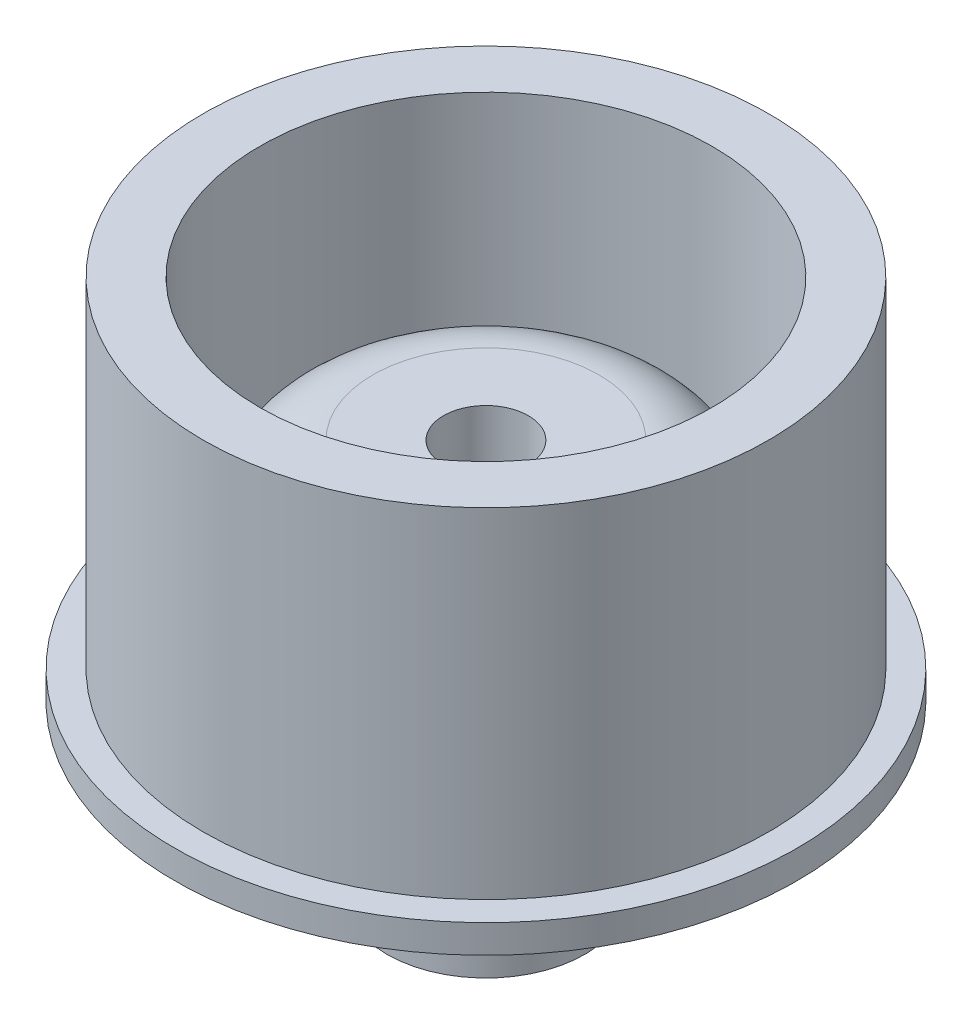
ISO-10303-21;
HEADER;
FILE_DESCRIPTION(('STEP AP214'),'2;1');
FILE_NAME('part.step','',(''),(''),'','','');
FILE_SCHEMA(('AUTOMOTIVE_DESIGN { 1 0 10303 214 1 1 1 1 }'));
ENDSEC;
DATA;
#1=APPLICATION_CONTEXT('core data for automotive mechanical design processes');
#2=APPLICATION_PROTOCOL_DEFINITION('international standard','automotive_design',2000,#1);
#3=PRODUCT_CONTEXT('',#1,'mechanical');
#4=PRODUCT('Part','Part','',(#3));
#5=PRODUCT_RELATED_PRODUCT_CATEGORY('part','',(#4));
#6=PRODUCT_DEFINITION_FORMATION('','',#4);
#7=PRODUCT_DEFINITION_CONTEXT('part definition',#1,'design');
#8=PRODUCT_DEFINITION('design','',#6,#7);
#9=PRODUCT_DEFINITION_SHAPE('','',#8);
#10=(LENGTH_UNIT() NAMED_UNIT(*) SI_UNIT(.MILLI.,.METRE.));
#11=(NAMED_UNIT(*) PLANE_ANGLE_UNIT() SI_UNIT($,.RADIAN.));
#12=(NAMED_UNIT(*) SI_UNIT($,.STERADIAN.) SOLID_ANGLE_UNIT());
#13=UNCERTAINTY_MEASURE_WITH_UNIT(LENGTH_MEASURE(1.E-05),#10,'distance_accuracy_value','');
#14=(GEOMETRIC_REPRESENTATION_CONTEXT(3) GLOBAL_UNCERTAINTY_ASSIGNED_CONTEXT((#13)) GLOBAL_UNIT_ASSIGNED_CONTEXT((#10,
#11,#12)) REPRESENTATION_CONTEXT('',''));
#15=CARTESIAN_POINT('',(0.,0.,0.));
#16=DIRECTION('',(0.,0.,1.));
#17=DIRECTION('',(1.,0.,0.));
#18=AXIS2_PLACEMENT_3D('',#15,#16,#17);
#19=CARTESIAN_POINT('',(0.,12.,0.));
#20=DIRECTION('',(0.,-1.,0.));
#21=DIRECTION('',(0.,0.,-1.));
#22=AXIS2_PLACEMENT_3D('',#19,#20,#21);
#23=CYLINDRICAL_SURFACE('',#22,10.);
#24=CARTESIAN_POINT('',(0.,12.,0.));
#25=DIRECTION('',(0.,1.,0.));
#26=DIRECTION('',(0.,0.,1.));
#27=AXIS2_PLACEMENT_3D('',#24,#25,#26);
#28=CIRCLE('',#27,10.);
#29=CARTESIAN_POINT('',(0.,12.,10.));
#30=VERTEX_POINT('',#29);
#31=EDGE_CURVE('E48',#30,#30,#28,.T.);
#32=ORIENTED_EDGE('',*,*,#31,.F.);
#33=EDGE_LOOP('',(#32));
#34=FACE_BOUND('',#33,.T.);
#35=CARTESIAN_POINT('',(0.,0.,0.));
#36=DIRECTION('',(0.,1.,0.));
#37=DIRECTION('',(0.,0.,1.));
#38=AXIS2_PLACEMENT_3D('',#35,#36,#37);
#39=CIRCLE('',#38,10.);
#40=CARTESIAN_POINT('',(0.,0.,10.));
#41=VERTEX_POINT('',#40);
#42=EDGE_CURVE('E52',#41,#41,#39,.T.);
#43=ORIENTED_EDGE('',*,*,#42,.T.);
#44=EDGE_LOOP('',(#43));
#45=FACE_BOUND('',#44,.T.);
#46=ADVANCED_FACE('F37',(#34,#45),#23,.T.);
#47=CARTESIAN_POINT('',(0.,12.,0.));
#48=DIRECTION('',(0.,1.,0.));
#49=DIRECTION('',(0.,0.,1.));
#50=AXIS2_PLACEMENT_3D('',#47,#48,#49);
#51=PLANE('',#50);
#52=CARTESIAN_POINT('',(0.,12.,0.));
#53=DIRECTION('',(0.,1.,0.));
#54=DIRECTION('',(0.,0.,1.));
#55=AXIS2_PLACEMENT_3D('',#52,#53,#54);
#56=CIRCLE('',#55,8.);
#57=CARTESIAN_POINT('',(0.,12.,8.));
#58=VERTEX_POINT('',#57);
#59=EDGE_CURVE('E78',#58,#58,#56,.T.);
#60=ORIENTED_EDGE('',*,*,#59,.F.);
#61=EDGE_LOOP('',(#60));
#62=FACE_BOUND('',#61,.T.);
#63=ORIENTED_EDGE('',*,*,#31,.T.);
#64=EDGE_LOOP('',(#63));
#65=FACE_BOUND('',#64,.T.);
#66=ADVANCED_FACE('F109',(#62,#65),#51,.T.);
#67=CARTESIAN_POINT('',(0.,-1.,0.));
#68=DIRECTION('',(0.,1.,0.));
#69=DIRECTION('',(0.,0.,1.));
#70=AXIS2_PLACEMENT_3D('',#67,#68,#69);
#71=CYLINDRICAL_SURFACE('',#70,11.);
#72=CARTESIAN_POINT('',(0.,-1.,0.));
#73=DIRECTION('',(0.,-1.,0.));
#74=DIRECTION('',(0.,0.,-1.));
#75=AXIS2_PLACEMENT_3D('',#72,#73,#74);
#76=CIRCLE('',#75,11.);
#77=CARTESIAN_POINT('',(0.,-1.,-11.));
#78=VERTEX_POINT('',#77);
#79=EDGE_CURVE('E61',#78,#78,#76,.T.);
#80=ORIENTED_EDGE('',*,*,#79,.F.);
#81=EDGE_LOOP('',(#80));
#82=FACE_BOUND('',#81,.T.);
#83=CARTESIAN_POINT('',(0.,0.,0.));
#84=DIRECTION('',(0.,-1.,0.));
#85=DIRECTION('',(0.,0.,-1.));
#86=AXIS2_PLACEMENT_3D('',#83,#84,#85);
#87=CIRCLE('',#86,11.);
#88=CARTESIAN_POINT('',(0.,0.,-11.));
#89=VERTEX_POINT('',#88);
#90=EDGE_CURVE('E58',#89,#89,#87,.T.);
#91=ORIENTED_EDGE('',*,*,#90,.T.);
#92=EDGE_LOOP('',(#91));
#93=FACE_BOUND('',#92,.T.);
#94=ADVANCED_FACE('F115',(#82,#93),#71,.T.);
#95=CARTESIAN_POINT('',(0.,-1.,0.));
#96=DIRECTION('',(0.,-1.,0.));
#97=DIRECTION('',(0.,0.,-1.));
#98=AXIS2_PLACEMENT_3D('',#95,#96,#97);
#99=PLANE('',#98);
#100=CARTESIAN_POINT('',(0.,-1.,0.));
#101=DIRECTION('',(0.,-1.,0.));
#102=DIRECTION('',(0.,0.,-1.));
#103=AXIS2_PLACEMENT_3D('',#100,#101,#102);
#104=CIRCLE('',#103,5.);
#105=CARTESIAN_POINT('',(0.,-1.,5.));
#106=VERTEX_POINT('',#105);
#107=EDGE_CURVE('E55',#106,#106,#104,.F.);
#108=ORIENTED_EDGE('',*,*,#107,.T.);
#109=EDGE_LOOP('',(#108));
#110=FACE_BOUND('',#109,.T.);
#111=ORIENTED_EDGE('',*,*,#79,.T.);
#112=EDGE_LOOP('',(#111));
#113=FACE_BOUND('',#112,.T.);
#114=ADVANCED_FACE('F122',(#110,#113),#99,.T.);
#115=CARTESIAN_POINT('',(0.,0.,0.));
#116=DIRECTION('',(0.,-1.,0.));
#117=DIRECTION('',(0.,0.,-1.));
#118=AXIS2_PLACEMENT_3D('',#115,#116,#117);
#119=PLANE('',#118);
#120=ORIENTED_EDGE('',*,*,#42,.F.);
#121=EDGE_LOOP('',(#120));
#122=FACE_BOUND('',#121,.T.);
#123=ORIENTED_EDGE('',*,*,#90,.F.);
#124=EDGE_LOOP('',(#123));
#125=FACE_BOUND('',#124,.T.);
#126=ADVANCED_FACE('F124',(#122,#125),#119,.F.);
#127=CARTESIAN_POINT('',(0.,-1.000012,0.));
#128=DIRECTION('',(0.,1.,0.));
#129=DIRECTION('',(0.,0.,1.));
#130=AXIS2_PLACEMENT_3D('',#127,#128,#129);
#131=CYLINDRICAL_SURFACE('',#130,5.);
#132=CARTESIAN_POINT('',(0.,5.,0.));
#133=DIRECTION('',(0.,-1.,0.));
#134=DIRECTION('',(0.,0.,-1.));
#135=AXIS2_PLACEMENT_3D('',#132,#133,#134);
#136=CIRCLE('',#135,5.);
#137=CARTESIAN_POINT('',(0.,5.,5.));
#138=VERTEX_POINT('',#137);
#139=EDGE_CURVE('E59',#138,#138,#136,.T.);
#140=CARTESIAN_POINT('',(0.,-1.,5.));
#141=CARTESIAN_POINT('',(0.,-0.9375,5.));
#142=CARTESIAN_POINT('',(0.,-0.875,5.));
#143=CARTESIAN_POINT('',(0.,-0.75,5.));
#144=CARTESIAN_POINT('',(0.,-0.6875,5.));
#145=CARTESIAN_POINT('',(0.,-0.5625,5.));
#146=CARTESIAN_POINT('',(0.,-0.5,5.));
#147=CARTESIAN_POINT('',(0.,-0.375,5.));
#148=CARTESIAN_POINT('',(0.,-0.3125,5.));
#149=CARTESIAN_POINT('',(0.,-0.1875,5.));
#150=CARTESIAN_POINT('',(0.,-0.125,5.));
#151=CARTESIAN_POINT('',(0.,0.,5.));
#152=CARTESIAN_POINT('',(0.,0.0625000000000001,5.));
#153=CARTESIAN_POINT('',(0.,0.1875,5.));
#154=CARTESIAN_POINT('',(0.,0.25,5.));
#155=CARTESIAN_POINT('',(0.,0.375,5.));
#156=CARTESIAN_POINT('',(0.,0.4375,5.));
#157=CARTESIAN_POINT('',(0.,0.5625,5.));
#158=CARTESIAN_POINT('',(0.,0.625,5.));
#159=CARTESIAN_POINT('',(0.,0.75,5.));
#160=CARTESIAN_POINT('',(0.,0.8125,5.));
#161=CARTESIAN_POINT('',(0.,0.9375,5.));
#162=CARTESIAN_POINT('',(0.,1.,5.));
#163=CARTESIAN_POINT('',(0.,1.125,5.));
#164=CARTESIAN_POINT('',(0.,1.1875,5.));
#165=CARTESIAN_POINT('',(0.,1.3125,5.));
#166=CARTESIAN_POINT('',(0.,1.375,5.));
#167=CARTESIAN_POINT('',(0.,1.5,5.));
#168=CARTESIAN_POINT('',(0.,1.5625,5.));
#169=CARTESIAN_POINT('',(0.,1.6875,5.));
#170=CARTESIAN_POINT('',(0.,1.75,5.));
#171=CARTESIAN_POINT('',(0.,1.875,5.));
#172=CARTESIAN_POINT('',(0.,1.9375,5.));
#173=CARTESIAN_POINT('',(0.,2.0625,5.));
#174=CARTESIAN_POINT('',(0.,2.125,5.));
#175=CARTESIAN_POINT('',(0.,2.25,5.));
#176=CARTESIAN_POINT('',(0.,2.3125,5.));
#177=CARTESIAN_POINT('',(0.,2.4375,5.));
#178=CARTESIAN_POINT('',(0.,2.5,5.));
#179=CARTESIAN_POINT('',(0.,2.625,5.));
#180=CARTESIAN_POINT('',(0.,2.6875,5.));
#181=CARTESIAN_POINT('',(0.,2.8125,5.));
#182=CARTESIAN_POINT('',(0.,2.875,5.));
#183=CARTESIAN_POINT('',(0.,3.,5.));
#184=CARTESIAN_POINT('',(0.,3.0625,5.));
#185=CARTESIAN_POINT('',(0.,3.1875,5.));
#186=CARTESIAN_POINT('',(0.,3.25,5.));
#187=CARTESIAN_POINT('',(0.,3.375,5.));
#188=CARTESIAN_POINT('',(0.,3.4375,5.));
#189=CARTESIAN_POINT('',(0.,3.5625,5.));
#190=CARTESIAN_POINT('',(0.,3.625,5.));
#191=CARTESIAN_POINT('',(0.,3.75,5.));
#192=CARTESIAN_POINT('',(0.,3.8125,5.));
#193=CARTESIAN_POINT('',(0.,3.9375,5.));
#194=CARTESIAN_POINT('',(0.,4.,5.));
#195=CARTESIAN_POINT('',(0.,4.125,5.));
#196=CARTESIAN_POINT('',(0.,4.1875,5.));
#197=CARTESIAN_POINT('',(0.,4.3125,5.));
#198=CARTESIAN_POINT('',(0.,4.375,5.));
#199=CARTESIAN_POINT('',(0.,4.5,5.));
#200=CARTESIAN_POINT('',(0.,4.5625,5.));
#201=CARTESIAN_POINT('',(0.,4.6875,5.));
#202=CARTESIAN_POINT('',(0.,4.75,5.));
#203=CARTESIAN_POINT('',(0.,4.875,5.));
#204=CARTESIAN_POINT('',(0.,4.9375,5.));
#205=CARTESIAN_POINT('',(0.,5.,5.));
#206=B_SPLINE_CURVE_WITH_KNOTS('',3,(#140,#141,#142,#143,#144,#145,#146,#147,#148,#149,#150,
#151,#152,#153,#154,#155,#156,#157,#158,#159,#160,#161,#162,#163,#164,#165,#166,#167,#168,#169,
#170,#171,#172,#173,#174,#175,#176,#177,#178,#179,#180,#181,#182,#183,#184,#185,#186,#187,#188,
#189,#190,#191,#192,#193,#194,#195,#196,#197,#198,#199,#200,#201,#202,#203,#204,#205),
.UNSPECIFIED.,.F.,.F.,(4,2,2,2,2,2,2,2,2,2,2,2,2,2,2,2,2,2,2,2,2,2,2,2,2,2,2,2,2,2,2,2,4),(0.,
0.1875,0.375,0.5625,0.75,0.9375,1.125,1.3125,1.5,1.6875,1.875,2.0625,2.25,2.4375,2.625,2.8125,
3.,3.1875,3.375,3.5625,3.75,3.9375,4.125,4.3125,4.5,4.6875,4.875,5.0625,5.25,5.4375,5.625,
5.8125,6.),.UNSPECIFIED.);
#207=EDGE_CURVE('BSEAM127',#106,#138,#206,.T.);
#208=ORIENTED_EDGE('',*,*,#107,.F.);
#209=ORIENTED_EDGE('',*,*,#139,.F.);
#210=ORIENTED_EDGE('',*,*,#207,.T.);
#211=ORIENTED_EDGE('',*,*,#207,.F.);
#212=EDGE_LOOP('',(#208,#210,#209,#211));
#213=FACE_BOUND('',#212,.T.);
#214=ADVANCED_FACE('F127',(#213),#131,.F.);
#215=CARTESIAN_POINT('',(0.,-1.000012,0.));
#216=DIRECTION('',(0.,1.,0.));
#217=DIRECTION('',(0.,0.,1.));
#218=AXIS2_PLACEMENT_3D('',#215,#216,#217);
#219=CYLINDRICAL_SURFACE('',#218,3.5);
#220=CARTESIAN_POINT('',(0.,5.,0.));
#221=DIRECTION('',(0.,-1.,0.));
#222=DIRECTION('',(0.,0.,-1.));
#223=AXIS2_PLACEMENT_3D('',#220,#221,#222);
#224=CIRCLE('',#223,3.5);
#225=CARTESIAN_POINT('',(0.,5.,3.5));
#226=VERTEX_POINT('',#225);
#227=EDGE_CURVE('E69',#226,#226,#224,.T.);
#228=CARTESIAN_POINT('',(0.,-7.,0.));
#229=DIRECTION('',(0.,-1.,0.));
#230=DIRECTION('',(0.,0.,-1.));
#231=AXIS2_PLACEMENT_3D('',#228,#229,#230);
#232=CIRCLE('',#231,3.5);
#233=CARTESIAN_POINT('',(0.,-7.,3.5));
#234=VERTEX_POINT('',#233);
#235=EDGE_CURVE('E72',#234,#234,#232,.T.);
#236=CARTESIAN_POINT('',(0.,5.,3.5));
#237=CARTESIAN_POINT('',(0.,4.875,3.5));
#238=CARTESIAN_POINT('',(0.,4.75,3.5));
#239=CARTESIAN_POINT('',(0.,4.5,3.5));
#240=CARTESIAN_POINT('',(0.,4.375,3.5));
#241=CARTESIAN_POINT('',(0.,4.125,3.5));
#242=CARTESIAN_POINT('',(0.,4.,3.5));
#243=CARTESIAN_POINT('',(0.,3.75,3.5));
#244=CARTESIAN_POINT('',(0.,3.625,3.5));
#245=CARTESIAN_POINT('',(0.,3.375,3.5));
#246=CARTESIAN_POINT('',(0.,3.25,3.5));
#247=CARTESIAN_POINT('',(0.,3.,3.5));
#248=CARTESIAN_POINT('',(0.,2.875,3.5));
#249=CARTESIAN_POINT('',(0.,2.625,3.5));
#250=CARTESIAN_POINT('',(0.,2.5,3.5));
#251=CARTESIAN_POINT('',(0.,2.25,3.5));
#252=CARTESIAN_POINT('',(0.,2.125,3.5));
#253=CARTESIAN_POINT('',(0.,1.875,3.5));
#254=CARTESIAN_POINT('',(0.,1.75,3.5));
#255=CARTESIAN_POINT('',(0.,1.5,3.5));
#256=CARTESIAN_POINT('',(0.,1.375,3.5));
#257=CARTESIAN_POINT('',(0.,1.125,3.5));
#258=CARTESIAN_POINT('',(0.,1.,3.5));
#259=CARTESIAN_POINT('',(0.,0.75,3.5));
#260=CARTESIAN_POINT('',(0.,0.625,3.5));
#261=CARTESIAN_POINT('',(0.,0.375,3.5));
#262=CARTESIAN_POINT('',(0.,0.25,3.5));
#263=CARTESIAN_POINT('',(0.,0.,3.5));
#264=CARTESIAN_POINT('',(0.,-0.125,3.5));
#265=CARTESIAN_POINT('',(0.,-0.375,3.5));
#266=CARTESIAN_POINT('',(0.,-0.5,3.5));
#267=CARTESIAN_POINT('',(0.,-0.75,3.5));
#268=CARTESIAN_POINT('',(0.,-0.875,3.5));
#269=CARTESIAN_POINT('',(0.,-1.125,3.5));
#270=CARTESIAN_POINT('',(0.,-1.25,3.5));
#271=CARTESIAN_POINT('',(0.,-1.5,3.5));
#272=CARTESIAN_POINT('',(0.,-1.625,3.5));
#273=CARTESIAN_POINT('',(0.,-1.875,3.5));
#274=CARTESIAN_POINT('',(0.,-2.,3.5));
#275=CARTESIAN_POINT('',(0.,-2.25,3.5));
#276=CARTESIAN_POINT('',(0.,-2.375,3.5));
#277=CARTESIAN_POINT('',(0.,-2.625,3.5));
#278=CARTESIAN_POINT('',(0.,-2.75,3.5));
#279=CARTESIAN_POINT('',(0.,-3.,3.5));
#280=CARTESIAN_POINT('',(0.,-3.125,3.5));
#281=CARTESIAN_POINT('',(0.,-3.375,3.5));
#282=CARTESIAN_POINT('',(0.,-3.5,3.5));
#283=CARTESIAN_POINT('',(0.,-3.75,3.5));
#284=CARTESIAN_POINT('',(0.,-3.875,3.5));
#285=CARTESIAN_POINT('',(0.,-4.125,3.5));
#286=CARTESIAN_POINT('',(0.,-4.25,3.5));
#287=CARTESIAN_POINT('',(0.,-4.5,3.5));
#288=CARTESIAN_POINT('',(0.,-4.625,3.5));
#289=CARTESIAN_POINT('',(0.,-4.875,3.5));
#290=CARTESIAN_POINT('',(0.,-5.,3.5));
#291=CARTESIAN_POINT('',(0.,-5.25,3.5));
#292=CARTESIAN_POINT('',(0.,-5.375,3.5));
#293=CARTESIAN_POINT('',(0.,-5.625,3.5));
#294=CARTESIAN_POINT('',(0.,-5.75,3.5));
#295=CARTESIAN_POINT('',(0.,-6.,3.5));
#296=CARTESIAN_POINT('',(0.,-6.125,3.5));
#297=CARTESIAN_POINT('',(0.,-6.375,3.5));
#298=CARTESIAN_POINT('',(0.,-6.5,3.5));
#299=CARTESIAN_POINT('',(0.,-6.75,3.5));
#300=CARTESIAN_POINT('',(0.,-6.875,3.5));
#301=CARTESIAN_POINT('',(0.,-7.,3.5));
#302=B_SPLINE_CURVE_WITH_KNOTS('',3,(#236,#237,#238,#239,#240,#241,#242,#243,#244,#245,#246,
#247,#248,#249,#250,#251,#252,#253,#254,#255,#256,#257,#258,#259,#260,#261,#262,#263,#264,#265,
#266,#267,#268,#269,#270,#271,#272,#273,#274,#275,#276,#277,#278,#279,#280,#281,#282,#283,#284,
#285,#286,#287,#288,#289,#290,#291,#292,#293,#294,#295,#296,#297,#298,#299,#300,#301),
.UNSPECIFIED.,.F.,.F.,(4,2,2,2,2,2,2,2,2,2,2,2,2,2,2,2,2,2,2,2,2,2,2,2,2,2,2,2,2,2,2,2,4),(0.,
0.375,0.75,1.125,1.5,1.875,2.25,2.625,3.,3.375,3.75,4.125,4.5,4.875,5.25,5.625,6.,6.375,6.75,
7.125,7.5,7.875,8.25,8.625,9.,9.375,9.75,10.125,10.5,10.875,11.25,11.625,12.),.UNSPECIFIED.);
#303=EDGE_CURVE('BSEAM134',#226,#234,#302,.T.);
#304=ORIENTED_EDGE('',*,*,#227,.T.);
#305=ORIENTED_EDGE('',*,*,#235,.F.);
#306=ORIENTED_EDGE('',*,*,#303,.T.);
#307=ORIENTED_EDGE('',*,*,#303,.F.);
#308=EDGE_LOOP('',(#304,#306,#305,#307));
#309=FACE_BOUND('',#308,.T.);
#310=ADVANCED_FACE('F134',(#309),#219,.T.);
#311=CARTESIAN_POINT('',(0.,5.,0.));
#312=DIRECTION('',(0.,-1.,0.));
#313=DIRECTION('',(0.,0.,-1.));
#314=AXIS2_PLACEMENT_3D('',#311,#312,#313);
#315=PLANE('',#314);
#316=ORIENTED_EDGE('',*,*,#227,.F.);
#317=EDGE_LOOP('',(#316));
#318=FACE_BOUND('',#317,.T.);
#319=ORIENTED_EDGE('',*,*,#139,.T.);
#320=EDGE_LOOP('',(#319));
#321=FACE_BOUND('',#320,.T.);
#322=ADVANCED_FACE('F138',(#318,#321),#315,.T.);
#323=CARTESIAN_POINT('',(0.,-7.,0.));
#324=DIRECTION('',(0.,-1.,0.));
#325=DIRECTION('',(0.,0.,-1.));
#326=AXIS2_PLACEMENT_3D('',#323,#324,#325);
#327=PLANE('',#326);
#328=ORIENTED_EDGE('',*,*,#235,.T.);
#329=EDGE_LOOP('',(#328));
#330=FACE_BOUND('',#329,.T.);
#331=ADVANCED_FACE('F105',(#330),#327,.T.);
#332=CARTESIAN_POINT('',(0.,12.,0.));
#333=DIRECTION('',(0.,-1.,0.));
#334=DIRECTION('',(0.,0.,-1.));
#335=AXIS2_PLACEMENT_3D('',#332,#333,#334);
#336=CYLINDRICAL_SURFACE('',#335,8.);
#337=ORIENTED_EDGE('',*,*,#59,.T.);
#338=EDGE_LOOP('',(#337));
#339=FACE_BOUND('',#338,.T.);
#340=CARTESIAN_POINT('',(0.,1.,0.));
#341=DIRECTION('',(0.,-1.,0.));
#342=DIRECTION('',(0.,0.,-1.));
#343=AXIS2_PLACEMENT_3D('',#340,#341,#342);
#344=CIRCLE('',#343,8.);
#345=CARTESIAN_POINT('',(0.,1.,-8.));
#346=VERTEX_POINT('',#345);
#347=EDGE_CURVE('E75',#346,#346,#344,.F.);
#348=ORIENTED_EDGE('',*,*,#347,.F.);
#349=EDGE_LOOP('',(#348));
#350=FACE_BOUND('',#349,.T.);
#351=ADVANCED_FACE('F95',(#339,#350),#336,.F.);
#352=CARTESIAN_POINT('',(0.,1.,0.));
#353=DIRECTION('',(0.,-1.,0.));
#354=DIRECTION('',(0.,0.,-1.));
#355=AXIS2_PLACEMENT_3D('',#352,#353,#354);
#356=PLANE('',#355);
#357=ORIENTED_EDGE('',*,*,#347,.T.);
#358=EDGE_LOOP('',(#357));
#359=FACE_BOUND('',#358,.T.);
#360=CARTESIAN_POINT('',(0.,1.,0.));
#361=DIRECTION('',(0.,-1.,0.));
#362=DIRECTION('',(0.,0.,-1.));
#363=AXIS2_PLACEMENT_3D('',#360,#361,#362);
#364=CIRCLE('',#363,7.);
#365=CARTESIAN_POINT('',(0.,1.,7.));
#366=VERTEX_POINT('',#365);
#367=EDGE_CURVE('E81',#366,#366,#364,.F.);
#368=ORIENTED_EDGE('',*,*,#367,.F.);
#369=EDGE_LOOP('',(#368));
#370=FACE_BOUND('',#369,.T.);
#371=ADVANCED_FACE('F93',(#359,#370),#356,.F.);
#372=CARTESIAN_POINT('',(0.,-1.000012,0.));
#373=DIRECTION('',(0.,1.,0.));
#374=DIRECTION('',(0.,0.,1.));
#375=AXIS2_PLACEMENT_3D('',#372,#373,#374);
#376=CYLINDRICAL_SURFACE('',#375,7.);
#377=CARTESIAN_POINT('',(0.,4.,0.));
#378=DIRECTION('',(0.,-1.,0.));
#379=DIRECTION('',(0.,0.,-1.));
#380=AXIS2_PLACEMENT_3D('',#377,#378,#379);
#381=CIRCLE('',#380,7.);
#382=CARTESIAN_POINT('',(0.,4.,7.));
#383=VERTEX_POINT('',#382);
#384=EDGE_CURVE('E44',#383,#383,#381,.T.);
#385=CARTESIAN_POINT('',(0.,4.,7.));
#386=CARTESIAN_POINT('',(0.,3.96875,7.));
#387=CARTESIAN_POINT('',(0.,3.9375,7.));
#388=CARTESIAN_POINT('',(0.,3.875,7.));
#389=CARTESIAN_POINT('',(0.,3.84375,7.));
#390=CARTESIAN_POINT('',(0.,3.78125,7.));
#391=CARTESIAN_POINT('',(0.,3.75,7.));
#392=CARTESIAN_POINT('',(0.,3.6875,7.));
#393=CARTESIAN_POINT('',(0.,3.65625,7.));
#394=CARTESIAN_POINT('',(0.,3.59375,7.));
#395=CARTESIAN_POINT('',(0.,3.5625,7.));
#396=CARTESIAN_POINT('',(0.,3.5,7.));
#397=CARTESIAN_POINT('',(0.,3.46875,7.));
#398=CARTESIAN_POINT('',(0.,3.40625,7.));
#399=CARTESIAN_POINT('',(0.,3.375,7.));
#400=CARTESIAN_POINT('',(0.,3.3125,7.));
#401=CARTESIAN_POINT('',(0.,3.28125,7.));
#402=CARTESIAN_POINT('',(0.,3.21875,7.));
#403=CARTESIAN_POINT('',(0.,3.1875,7.));
#404=CARTESIAN_POINT('',(0.,3.125,7.));
#405=CARTESIAN_POINT('',(0.,3.09375,7.));
#406=CARTESIAN_POINT('',(0.,3.03125,7.));
#407=CARTESIAN_POINT('',(0.,3.,7.));
#408=CARTESIAN_POINT('',(0.,2.9375,7.));
#409=CARTESIAN_POINT('',(0.,2.90625,7.));
#410=CARTESIAN_POINT('',(0.,2.84375,7.));
#411=CARTESIAN_POINT('',(0.,2.8125,7.));
#412=CARTESIAN_POINT('',(0.,2.75,7.));
#413=CARTESIAN_POINT('',(0.,2.71875,7.));
#414=CARTESIAN_POINT('',(0.,2.65625,7.));
#415=CARTESIAN_POINT('',(0.,2.625,7.));
#416=CARTESIAN_POINT('',(0.,2.5625,7.));
#417=CARTESIAN_POINT('',(0.,2.53125,7.));
#418=CARTESIAN_POINT('',(0.,2.46875,7.));
#419=CARTESIAN_POINT('',(0.,2.4375,7.));
#420=CARTESIAN_POINT('',(0.,2.375,7.));
#421=CARTESIAN_POINT('',(0.,2.34375,7.));
#422=CARTESIAN_POINT('',(0.,2.28125,7.));
#423=CARTESIAN_POINT('',(0.,2.25,7.));
#424=CARTESIAN_POINT('',(0.,2.1875,7.));
#425=CARTESIAN_POINT('',(0.,2.15625,7.));
#426=CARTESIAN_POINT('',(0.,2.09375,7.));
#427=CARTESIAN_POINT('',(0.,2.0625,7.));
#428=CARTESIAN_POINT('',(0.,2.,7.));
#429=CARTESIAN_POINT('',(0.,1.96875,7.));
#430=CARTESIAN_POINT('',(0.,1.90625,7.));
#431=CARTESIAN_POINT('',(0.,1.875,7.));
#432=CARTESIAN_POINT('',(0.,1.8125,7.));
#433=CARTESIAN_POINT('',(0.,1.78125,7.));
#434=CARTESIAN_POINT('',(0.,1.71875,7.));
#435=CARTESIAN_POINT('',(0.,1.6875,7.));
#436=CARTESIAN_POINT('',(0.,1.625,7.));
#437=CARTESIAN_POINT('',(0.,1.59375,7.));
#438=CARTESIAN_POINT('',(0.,1.53125,7.));
#439=CARTESIAN_POINT('',(0.,1.5,7.));
#440=CARTESIAN_POINT('',(0.,1.4375,7.));
#441=CARTESIAN_POINT('',(0.,1.40625,7.));
#442=CARTESIAN_POINT('',(0.,1.34375,7.));
#443=CARTESIAN_POINT('',(0.,1.3125,7.));
#444=CARTESIAN_POINT('',(0.,1.25,7.));
#445=CARTESIAN_POINT('',(0.,1.21875,7.));
#446=CARTESIAN_POINT('',(0.,1.15625,7.));
#447=CARTESIAN_POINT('',(0.,1.125,7.));
#448=CARTESIAN_POINT('',(0.,1.0625,7.));
#449=CARTESIAN_POINT('',(0.,1.03125,7.));
#450=CARTESIAN_POINT('',(0.,1.,7.));
#451=B_SPLINE_CURVE_WITH_KNOTS('',3,(#385,#386,#387,#388,#389,#390,#391,#392,#393,#394,#395,
#396,#397,#398,#399,#400,#401,#402,#403,#404,#405,#406,#407,#408,#409,#410,#411,#412,#413,#414,
#415,#416,#417,#418,#419,#420,#421,#422,#423,#424,#425,#426,#427,#428,#429,#430,#431,#432,#433,
#434,#435,#436,#437,#438,#439,#440,#441,#442,#443,#444,#445,#446,#447,#448,#449,#450),
.UNSPECIFIED.,.F.,.F.,(4,2,2,2,2,2,2,2,2,2,2,2,2,2,2,2,2,2,2,2,2,2,2,2,2,2,2,2,2,2,2,2,4),(0.,
0.0937500000000001,0.1875,0.28125,0.375,0.46875,0.5625,0.656250000000001,0.750000000000001,
0.843750000000001,0.937500000000001,1.03125,1.125,1.21875,1.3125,1.40625,1.5,1.59375,1.6875,
1.78125,1.875,1.96875,2.0625,2.15625,2.25,2.34375,2.4375,2.53125,2.625,2.71875,2.8125,2.90625,
3.),.UNSPECIFIED.);
#452=EDGE_CURVE('BSEAM91',#383,#366,#451,.T.);
#453=ORIENTED_EDGE('',*,*,#384,.T.);
#454=ORIENTED_EDGE('',*,*,#367,.T.);
#455=ORIENTED_EDGE('',*,*,#452,.T.);
#456=ORIENTED_EDGE('',*,*,#452,.F.);
#457=EDGE_LOOP('',(#453,#455,#454,#456));
#458=FACE_BOUND('',#457,.T.);
#459=ADVANCED_FACE('F91',(#458),#376,.T.);
#460=CARTESIAN_POINT('',(0.,-1.000012,0.));
#461=DIRECTION('',(0.,1.,0.));
#462=DIRECTION('',(0.,0.,1.));
#463=AXIS2_PLACEMENT_3D('',#460,#461,#462);
#464=CYLINDRICAL_SURFACE('',#463,1.5);
#465=CARTESIAN_POINT('',(0.,7.,0.));
#466=DIRECTION('',(0.,-1.,0.));
#467=DIRECTION('',(0.,0.,-1.));
#468=AXIS2_PLACEMENT_3D('',#465,#466,#467);
#469=CIRCLE('',#468,1.5);
#470=CARTESIAN_POINT('',(0.,7.,1.5));
#471=VERTEX_POINT('',#470);
#472=EDGE_CURVE('E85',#471,#471,#469,.T.);
#473=CARTESIAN_POINT('',(0.,-5.,0.));
#474=DIRECTION('',(0.,-1.,0.));
#475=DIRECTION('',(0.,0.,-1.));
#476=AXIS2_PLACEMENT_3D('',#473,#474,#475);
#477=CIRCLE('',#476,1.5);
#478=CARTESIAN_POINT('',(0.,-5.,1.5));
#479=VERTEX_POINT('',#478);
#480=EDGE_CURVE('E82',#479,#479,#477,.T.);
#481=CARTESIAN_POINT('',(0.,7.,1.5));
#482=CARTESIAN_POINT('',(0.,6.875,1.5));
#483=CARTESIAN_POINT('',(0.,6.75,1.5));
#484=CARTESIAN_POINT('',(0.,6.5,1.5));
#485=CARTESIAN_POINT('',(0.,6.375,1.5));
#486=CARTESIAN_POINT('',(0.,6.125,1.5));
#487=CARTESIAN_POINT('',(0.,6.,1.5));
#488=CARTESIAN_POINT('',(0.,5.75,1.5));
#489=CARTESIAN_POINT('',(0.,5.625,1.5));
#490=CARTESIAN_POINT('',(0.,5.375,1.5));
#491=CARTESIAN_POINT('',(0.,5.25,1.5));
#492=CARTESIAN_POINT('',(0.,5.,1.5));
#493=CARTESIAN_POINT('',(0.,4.875,1.5));
#494=CARTESIAN_POINT('',(0.,4.625,1.5));
#495=CARTESIAN_POINT('',(0.,4.5,1.5));
#496=CARTESIAN_POINT('',(0.,4.25,1.5));
#497=CARTESIAN_POINT('',(0.,4.125,1.5));
#498=CARTESIAN_POINT('',(0.,3.875,1.5));
#499=CARTESIAN_POINT('',(0.,3.75,1.5));
#500=CARTESIAN_POINT('',(0.,3.5,1.5));
#501=CARTESIAN_POINT('',(0.,3.375,1.5));
#502=CARTESIAN_POINT('',(0.,3.125,1.5));
#503=CARTESIAN_POINT('',(0.,3.,1.5));
#504=CARTESIAN_POINT('',(0.,2.75,1.5));
#505=CARTESIAN_POINT('',(0.,2.625,1.5));
#506=CARTESIAN_POINT('',(0.,2.375,1.5));
#507=CARTESIAN_POINT('',(0.,2.25,1.5));
#508=CARTESIAN_POINT('',(0.,2.,1.5));
#509=CARTESIAN_POINT('',(0.,1.875,1.5));
#510=CARTESIAN_POINT('',(0.,1.625,1.5));
#511=CARTESIAN_POINT('',(0.,1.5,1.5));
#512=CARTESIAN_POINT('',(0.,1.25,1.5));
#513=CARTESIAN_POINT('',(0.,1.125,1.5));
#514=CARTESIAN_POINT('',(0.,0.875000000000001,1.5));
#515=CARTESIAN_POINT('',(0.,0.750000000000001,1.5));
#516=CARTESIAN_POINT('',(0.,0.500000000000001,1.5));
#517=CARTESIAN_POINT('',(0.,0.375000000000001,1.5));
#518=CARTESIAN_POINT('',(0.,0.125000000000001,1.5));
#519=CARTESIAN_POINT('',(0.,0.,1.5));
#520=CARTESIAN_POINT('',(0.,-0.249999999999999,1.5));
#521=CARTESIAN_POINT('',(0.,-0.374999999999999,1.5));
#522=CARTESIAN_POINT('',(0.,-0.624999999999999,1.5));
#523=CARTESIAN_POINT('',(0.,-0.749999999999999,1.5));
#524=CARTESIAN_POINT('',(0.,-0.999999999999999,1.5));
#525=CARTESIAN_POINT('',(0.,-1.125,1.5));
#526=CARTESIAN_POINT('',(0.,-1.375,1.5));
#527=CARTESIAN_POINT('',(0.,-1.5,1.5));
#528=CARTESIAN_POINT('',(0.,-1.75,1.5));
#529=CARTESIAN_POINT('',(0.,-1.875,1.5));
#530=CARTESIAN_POINT('',(0.,-2.125,1.5));
#531=CARTESIAN_POINT('',(0.,-2.25,1.5));
#532=CARTESIAN_POINT('',(0.,-2.5,1.5));
#533=CARTESIAN_POINT('',(0.,-2.625,1.5));
#534=CARTESIAN_POINT('',(0.,-2.875,1.5));
#535=CARTESIAN_POINT('',(0.,-3.,1.5));
#536=CARTESIAN_POINT('',(0.,-3.25,1.5));
#537=CARTESIAN_POINT('',(0.,-3.375,1.5));
#538=CARTESIAN_POINT('',(0.,-3.625,1.5));
#539=CARTESIAN_POINT('',(0.,-3.75,1.5));
#540=CARTESIAN_POINT('',(0.,-4.,1.5));
#541=CARTESIAN_POINT('',(0.,-4.125,1.5));
#542=CARTESIAN_POINT('',(0.,-4.375,1.5));
#543=CARTESIAN_POINT('',(0.,-4.5,1.5));
#544=CARTESIAN_POINT('',(0.,-4.75,1.5));
#545=CARTESIAN_POINT('',(0.,-4.875,1.5));
#546=CARTESIAN_POINT('',(0.,-5.,1.5));
#547=B_SPLINE_CURVE_WITH_KNOTS('',3,(#481,#482,#483,#484,#485,#486,#487,#488,#489,#490,#491,
#492,#493,#494,#495,#496,#497,#498,#499,#500,#501,#502,#503,#504,#505,#506,#507,#508,#509,#510,
#511,#512,#513,#514,#515,#516,#517,#518,#519,#520,#521,#522,#523,#524,#525,#526,#527,#528,#529,
#530,#531,#532,#533,#534,#535,#536,#537,#538,#539,#540,#541,#542,#543,#544,#545,#546),
.UNSPECIFIED.,.F.,.F.,(4,2,2,2,2,2,2,2,2,2,2,2,2,2,2,2,2,2,2,2,2,2,2,2,2,2,2,2,2,2,2,2,4),(0.,
0.374999999999999,0.75,1.125,1.5,1.875,2.25,2.625,3.,3.375,3.75,4.125,4.5,4.875,5.25,5.625,6.,
6.375,6.75,7.125,7.5,7.875,8.25,8.625,9.,9.375,9.75,10.125,10.5,10.875,11.25,11.625,12.),.UNSPECIFIED.);
#548=EDGE_CURVE('BSEAM103',#471,#479,#547,.T.);
#549=ORIENTED_EDGE('',*,*,#472,.F.);
#550=ORIENTED_EDGE('',*,*,#480,.T.);
#551=ORIENTED_EDGE('',*,*,#548,.T.);
#552=ORIENTED_EDGE('',*,*,#548,.F.);
#553=EDGE_LOOP('',(#549,#551,#550,#552));
#554=FACE_BOUND('',#553,.T.);
#555=ADVANCED_FACE('F103',(#554),#464,.F.);
#556=CARTESIAN_POINT('',(0.,7.,0.));
#557=DIRECTION('',(0.,-1.,0.));
#558=DIRECTION('',(0.,0.,-1.));
#559=AXIS2_PLACEMENT_3D('',#556,#557,#558);
#560=PLANE('',#559);
#561=CARTESIAN_POINT('',(0.,7.,0.));
#562=DIRECTION('',(0.,-1.,0.));
#563=DIRECTION('',(0.,0.,-1.));
#564=AXIS2_PLACEMENT_3D('',#561,#562,#563);
#565=CIRCLE('',#564,4.);
#566=CARTESIAN_POINT('',(0.,7.,-4.));
#567=VERTEX_POINT('',#566);
#568=EDGE_CURVE('E10',#567,#567,#565,.F.);
#569=ORIENTED_EDGE('',*,*,#568,.T.);
#570=EDGE_LOOP('',(#569));
#571=FACE_BOUND('',#570,.T.);
#572=ORIENTED_EDGE('',*,*,#472,.T.);
#573=EDGE_LOOP('',(#572));
#574=FACE_BOUND('',#573,.T.);
#575=ADVANCED_FACE('F149',(#571,#574),#560,.F.);
#576=CARTESIAN_POINT('',(0.,-5.,0.));
#577=DIRECTION('',(0.,-1.,0.));
#578=DIRECTION('',(0.,0.,-1.));
#579=AXIS2_PLACEMENT_3D('',#576,#577,#578);
#580=PLANE('',#579);
#581=ORIENTED_EDGE('',*,*,#480,.F.);
#582=EDGE_LOOP('',(#581));
#583=FACE_BOUND('',#582,.T.);
#584=ADVANCED_FACE('F146',(#583),#580,.F.);
#585=CARTESIAN_POINT('',(0.,4.,0.));
#586=DIRECTION('',(0.,-1.,0.));
#587=DIRECTION('',(0.,0.,-1.));
#588=AXIS2_PLACEMENT_3D('',#585,#586,#587);
#589=TOROIDAL_SURFACE('',#588,4.,3.);
#590=ORIENTED_EDGE('',*,*,#568,.F.);
#591=EDGE_LOOP('',(#590));
#592=FACE_BOUND('',#591,.T.);
#593=ORIENTED_EDGE('',*,*,#384,.F.);
#594=EDGE_LOOP('',(#593));
#595=FACE_BOUND('',#594,.T.);
#596=ADVANCED_FACE('F39',(#592,#595),#589,.T.);
#597=CLOSED_SHELL('',(#46,#66,#94,#114,#126,#214,#310,#322,#331,#351,#371,#459,#555,#575,#584,#596));
#598=MANIFOLD_SOLID_BREP('B2',#597);
#599=ADVANCED_BREP_SHAPE_REPRESENTATION('',(#18,#598),#14);
#600=SHAPE_DEFINITION_REPRESENTATION(#9,#599);
ENDSEC;
END-ISO-10303-21;
